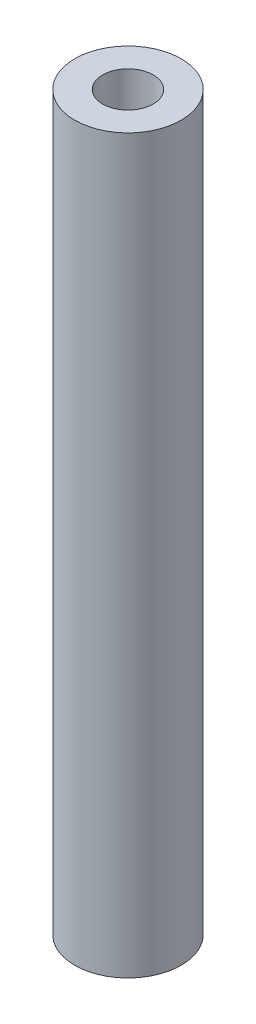
ISO-10303-21;
HEADER;
FILE_DESCRIPTION(('STEP AP214'),'2;1');
FILE_NAME('part.step','',(''),(''),'','','');
FILE_SCHEMA(('AUTOMOTIVE_DESIGN { 1 0 10303 214 1 1 1 1 }'));
ENDSEC;
DATA;
#1=APPLICATION_CONTEXT('core data for automotive mechanical design processes');
#2=APPLICATION_PROTOCOL_DEFINITION('international standard','automotive_design',2000,#1);
#3=PRODUCT_CONTEXT('',#1,'mechanical');
#4=PRODUCT('Part','Part','',(#3));
#5=PRODUCT_RELATED_PRODUCT_CATEGORY('part','',(#4));
#6=PRODUCT_DEFINITION_FORMATION('','',#4);
#7=PRODUCT_DEFINITION_CONTEXT('part definition',#1,'design');
#8=PRODUCT_DEFINITION('design','',#6,#7);
#9=PRODUCT_DEFINITION_SHAPE('','',#8);
#10=(LENGTH_UNIT() NAMED_UNIT(*) SI_UNIT(.MILLI.,.METRE.));
#11=(NAMED_UNIT(*) PLANE_ANGLE_UNIT() SI_UNIT($,.RADIAN.));
#12=(NAMED_UNIT(*) SI_UNIT($,.STERADIAN.) SOLID_ANGLE_UNIT());
#13=UNCERTAINTY_MEASURE_WITH_UNIT(LENGTH_MEASURE(1.E-05),#10,'distance_accuracy_value','');
#14=(GEOMETRIC_REPRESENTATION_CONTEXT(3) GLOBAL_UNCERTAINTY_ASSIGNED_CONTEXT((#13)) GLOBAL_UNIT_ASSIGNED_CONTEXT((#10,
#11,#12)) REPRESENTATION_CONTEXT('',''));
#15=CARTESIAN_POINT('',(0.,0.,0.));
#16=DIRECTION('',(0.,0.,1.));
#17=DIRECTION('',(1.,0.,0.));
#18=AXIS2_PLACEMENT_3D('',#15,#16,#17);
#19=CARTESIAN_POINT('',(0.,55.,0.));
#20=DIRECTION('',(0.,1.,0.));
#21=DIRECTION('',(0.,0.,1.));
#22=AXIS2_PLACEMENT_3D('',#19,#20,#21);
#23=PLANE('',#22);
#24=CARTESIAN_POINT('',(0.,55.,0.));
#25=DIRECTION('',(0.,1.,0.));
#26=DIRECTION('',(0.,0.,1.));
#27=AXIS2_PLACEMENT_3D('',#24,#25,#26);
#28=CIRCLE('',#27,4.);
#29=CARTESIAN_POINT('',(0.,55.,4.));
#30=VERTEX_POINT('',#29);
#31=EDGE_CURVE('E10',#30,#30,#28,.T.);
#32=ORIENTED_EDGE('',*,*,#31,.T.);
#33=EDGE_LOOP('',(#32));
#34=FACE_BOUND('',#33,.T.);
#35=CARTESIAN_POINT('',(0.,55.,0.));
#36=DIRECTION('',(0.,1.,0.));
#37=DIRECTION('',(0.,0.,1.));
#38=AXIS2_PLACEMENT_3D('',#35,#36,#37);
#39=CIRCLE('',#38,1.9);
#40=CARTESIAN_POINT('',(0.,55.,1.9));
#41=VERTEX_POINT('',#40);
#42=EDGE_CURVE('E50',#41,#41,#39,.T.);
#43=ORIENTED_EDGE('',*,*,#42,.F.);
#44=EDGE_LOOP('',(#43));
#45=FACE_BOUND('',#44,.T.);
#46=ADVANCED_FACE('F39',(#34,#45),#23,.T.);
#47=CARTESIAN_POINT('',(0.,0.,0.));
#48=DIRECTION('',(0.,1.,0.));
#49=DIRECTION('',(0.,0.,1.));
#50=AXIS2_PLACEMENT_3D('',#47,#48,#49);
#51=PLANE('',#50);
#52=CARTESIAN_POINT('',(0.,0.,0.));
#53=DIRECTION('',(0.,1.,0.));
#54=DIRECTION('',(0.,0.,1.));
#55=AXIS2_PLACEMENT_3D('',#52,#53,#54);
#56=CIRCLE('',#55,4.);
#57=CARTESIAN_POINT('',(0.,0.,4.));
#58=VERTEX_POINT('',#57);
#59=EDGE_CURVE('E43',#58,#58,#56,.T.);
#60=ORIENTED_EDGE('',*,*,#59,.F.);
#61=EDGE_LOOP('',(#60));
#62=FACE_BOUND('',#61,.T.);
#63=CARTESIAN_POINT('',(0.,0.,0.));
#64=DIRECTION('',(0.,1.,0.));
#65=DIRECTION('',(0.,0.,1.));
#66=AXIS2_PLACEMENT_3D('',#63,#64,#65);
#67=CIRCLE('',#66,1.9);
#68=CARTESIAN_POINT('',(0.,0.,1.9));
#69=VERTEX_POINT('',#68);
#70=EDGE_CURVE('E52',#69,#69,#67,.T.);
#71=ORIENTED_EDGE('',*,*,#70,.T.);
#72=EDGE_LOOP('',(#71));
#73=FACE_BOUND('',#72,.T.);
#74=ADVANCED_FACE('F62',(#62,#73),#51,.F.);
#75=CARTESIAN_POINT('',(0.,55.,0.));
#76=DIRECTION('',(0.,-1.,0.));
#77=DIRECTION('',(0.,0.,-1.));
#78=AXIS2_PLACEMENT_3D('',#75,#76,#77);
#79=CYLINDRICAL_SURFACE('',#78,4.);
#80=ORIENTED_EDGE('',*,*,#31,.F.);
#81=EDGE_LOOP('',(#80));
#82=FACE_BOUND('',#81,.T.);
#83=ORIENTED_EDGE('',*,*,#59,.T.);
#84=EDGE_LOOP('',(#83));
#85=FACE_BOUND('',#84,.T.);
#86=ADVANCED_FACE('F41',(#82,#85),#79,.T.);
#87=CARTESIAN_POINT('',(0.,55.,0.));
#88=DIRECTION('',(0.,-1.,0.));
#89=DIRECTION('',(0.,0.,-1.));
#90=AXIS2_PLACEMENT_3D('',#87,#88,#89);
#91=CYLINDRICAL_SURFACE('',#90,1.9);
#92=ORIENTED_EDGE('',*,*,#42,.T.);
#93=EDGE_LOOP('',(#92));
#94=FACE_BOUND('',#93,.T.);
#95=ORIENTED_EDGE('',*,*,#70,.F.);
#96=EDGE_LOOP('',(#95));
#97=FACE_BOUND('',#96,.T.);
#98=ADVANCED_FACE('F58',(#94,#97),#91,.F.);
#99=CLOSED_SHELL('',(#46,#74,#86,#98));
#100=MANIFOLD_SOLID_BREP('B2',#99);
#101=ADVANCED_BREP_SHAPE_REPRESENTATION('',(#18,#100),#14);
#102=SHAPE_DEFINITION_REPRESENTATION(#9,#101);
ENDSEC;
END-ISO-10303-21;
